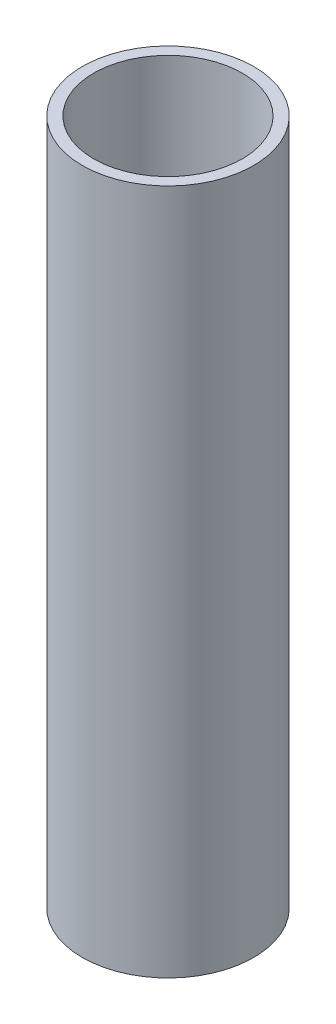
ISO-10303-21;
HEADER;
FILE_DESCRIPTION(('STEP AP214'),'2;1');
FILE_NAME('part.step','',(''),(''),'','','');
FILE_SCHEMA(('AUTOMOTIVE_DESIGN { 1 0 10303 214 1 1 1 1 }'));
ENDSEC;
DATA;
#1=APPLICATION_CONTEXT('core data for automotive mechanical design processes');
#2=APPLICATION_PROTOCOL_DEFINITION('international standard','automotive_design',2000,#1);
#3=PRODUCT_CONTEXT('',#1,'mechanical');
#4=PRODUCT('Part','Part','',(#3));
#5=PRODUCT_RELATED_PRODUCT_CATEGORY('part','',(#4));
#6=PRODUCT_DEFINITION_FORMATION('','',#4);
#7=PRODUCT_DEFINITION_CONTEXT('part definition',#1,'design');
#8=PRODUCT_DEFINITION('design','',#6,#7);
#9=PRODUCT_DEFINITION_SHAPE('','',#8);
#10=(LENGTH_UNIT() NAMED_UNIT(*) SI_UNIT(.MILLI.,.METRE.));
#11=(NAMED_UNIT(*) PLANE_ANGLE_UNIT() SI_UNIT($,.RADIAN.));
#12=(NAMED_UNIT(*) SI_UNIT($,.STERADIAN.) SOLID_ANGLE_UNIT());
#13=UNCERTAINTY_MEASURE_WITH_UNIT(LENGTH_MEASURE(1.E-05),#10,'distance_accuracy_value','');
#14=(GEOMETRIC_REPRESENTATION_CONTEXT(3) GLOBAL_UNCERTAINTY_ASSIGNED_CONTEXT((#13)) GLOBAL_UNIT_ASSIGNED_CONTEXT((#10,
#11,#12)) REPRESENTATION_CONTEXT('',''));
#15=CARTESIAN_POINT('',(0.,0.,0.));
#16=DIRECTION('',(0.,0.,1.));
#17=DIRECTION('',(1.,0.,0.));
#18=AXIS2_PLACEMENT_3D('',#15,#16,#17);
#19=CARTESIAN_POINT('',(0.,-152.4,0.));
#20=DIRECTION('',(0.,1.,0.));
#21=DIRECTION('',(0.,0.,1.));
#22=AXIS2_PLACEMENT_3D('',#19,#20,#21);
#23=CYLINDRICAL_SURFACE('',#22,19.05);
#24=CARTESIAN_POINT('',(0.,-152.4,0.));
#25=DIRECTION('',(0.,1.,0.));
#26=DIRECTION('',(0.,0.,1.));
#27=AXIS2_PLACEMENT_3D('',#24,#25,#26);
#28=CIRCLE('',#27,19.05);
#29=CARTESIAN_POINT('',(0.,-152.4,19.05));
#30=VERTEX_POINT('',#29);
#31=EDGE_CURVE('E11',#30,#30,#28,.T.);
#32=CARTESIAN_POINT('',(0.,0.,0.));
#33=DIRECTION('',(0.,1.,0.));
#34=DIRECTION('',(0.,0.,1.));
#35=AXIS2_PLACEMENT_3D('',#32,#33,#34);
#36=CIRCLE('',#35,19.05);
#37=CARTESIAN_POINT('',(0.,0.,19.05));
#38=VERTEX_POINT('',#37);
#39=EDGE_CURVE('E40',#38,#38,#36,.T.);
#40=CARTESIAN_POINT('',(0.,-152.4,19.05));
#41=CARTESIAN_POINT('',(0.,-150.8125,19.05));
#42=CARTESIAN_POINT('',(0.,-149.225,19.05));
#43=CARTESIAN_POINT('',(0.,-146.05,19.05));
#44=CARTESIAN_POINT('',(0.,-144.4625,19.05));
#45=CARTESIAN_POINT('',(0.,-141.2875,19.05));
#46=CARTESIAN_POINT('',(0.,-139.7,19.05));
#47=CARTESIAN_POINT('',(0.,-136.525,19.05));
#48=CARTESIAN_POINT('',(0.,-134.9375,19.05));
#49=CARTESIAN_POINT('',(0.,-131.7625,19.05));
#50=CARTESIAN_POINT('',(0.,-130.175,19.05));
#51=CARTESIAN_POINT('',(0.,-127.,19.05));
#52=CARTESIAN_POINT('',(0.,-125.4125,19.05));
#53=CARTESIAN_POINT('',(0.,-122.2375,19.05));
#54=CARTESIAN_POINT('',(0.,-120.65,19.05));
#55=CARTESIAN_POINT('',(0.,-117.475,19.05));
#56=CARTESIAN_POINT('',(0.,-115.8875,19.05));
#57=CARTESIAN_POINT('',(0.,-112.7125,19.05));
#58=CARTESIAN_POINT('',(0.,-111.125,19.05));
#59=CARTESIAN_POINT('',(0.,-107.95,19.05));
#60=CARTESIAN_POINT('',(0.,-106.3625,19.05));
#61=CARTESIAN_POINT('',(0.,-103.1875,19.05));
#62=CARTESIAN_POINT('',(0.,-101.6,19.05));
#63=CARTESIAN_POINT('',(0.,-98.425,19.05));
#64=CARTESIAN_POINT('',(0.,-96.8375,19.05));
#65=CARTESIAN_POINT('',(0.,-93.6625,19.05));
#66=CARTESIAN_POINT('',(0.,-92.075,19.05));
#67=CARTESIAN_POINT('',(0.,-88.9,19.05));
#68=CARTESIAN_POINT('',(0.,-87.3125,19.05));
#69=CARTESIAN_POINT('',(0.,-84.1375,19.05));
#70=CARTESIAN_POINT('',(0.,-82.55,19.05));
#71=CARTESIAN_POINT('',(0.,-79.375,19.05));
#72=CARTESIAN_POINT('',(0.,-77.7875,19.05));
#73=CARTESIAN_POINT('',(0.,-74.6125,19.05));
#74=CARTESIAN_POINT('',(0.,-73.025,19.05));
#75=CARTESIAN_POINT('',(0.,-69.85,19.05));
#76=CARTESIAN_POINT('',(0.,-68.2625,19.05));
#77=CARTESIAN_POINT('',(0.,-65.0875,19.05));
#78=CARTESIAN_POINT('',(0.,-63.5,19.05));
#79=CARTESIAN_POINT('',(0.,-60.325,19.05));
#80=CARTESIAN_POINT('',(0.,-58.7375,19.05));
#81=CARTESIAN_POINT('',(0.,-55.5625,19.05));
#82=CARTESIAN_POINT('',(0.,-53.975,19.05));
#83=CARTESIAN_POINT('',(0.,-50.8,19.05));
#84=CARTESIAN_POINT('',(0.,-49.2125,19.05));
#85=CARTESIAN_POINT('',(0.,-46.0375,19.05));
#86=CARTESIAN_POINT('',(0.,-44.45,19.05));
#87=CARTESIAN_POINT('',(0.,-41.275,19.05));
#88=CARTESIAN_POINT('',(0.,-39.6875,19.05));
#89=CARTESIAN_POINT('',(0.,-36.5125,19.05));
#90=CARTESIAN_POINT('',(0.,-34.925,19.05));
#91=CARTESIAN_POINT('',(0.,-31.75,19.05));
#92=CARTESIAN_POINT('',(0.,-30.1625,19.05));
#93=CARTESIAN_POINT('',(0.,-26.9875,19.05));
#94=CARTESIAN_POINT('',(0.,-25.4,19.05));
#95=CARTESIAN_POINT('',(0.,-22.225,19.05));
#96=CARTESIAN_POINT('',(0.,-20.6375,19.05));
#97=CARTESIAN_POINT('',(0.,-17.4625,19.05));
#98=CARTESIAN_POINT('',(0.,-15.875,19.05));
#99=CARTESIAN_POINT('',(0.,-12.7,19.05));
#100=CARTESIAN_POINT('',(0.,-11.1125,19.05));
#101=CARTESIAN_POINT('',(0.,-7.93750000000001,19.05));
#102=CARTESIAN_POINT('',(0.,-6.35,19.05));
#103=CARTESIAN_POINT('',(0.,-3.175,19.05));
#104=CARTESIAN_POINT('',(0.,-1.5875,19.05));
#105=CARTESIAN_POINT('',(0.,0.,19.05));
#106=B_SPLINE_CURVE_WITH_KNOTS('',3,(#40,#41,#42,#43,#44,#45,#46,#47,#48,#49,#50,#51,#52,#53,
#54,#55,#56,#57,#58,#59,#60,#61,#62,#63,#64,#65,#66,#67,#68,#69,#70,#71,#72,#73,#74,#75,#76,#77,
#78,#79,#80,#81,#82,#83,#84,#85,#86,#87,#88,#89,#90,#91,#92,#93,#94,#95,#96,#97,#98,#99,#100,
#101,#102,#103,#104,#105),.UNSPECIFIED.,.F.,.F.,(4,2,2,2,2,2,2,2,2,2,2,2,2,2,2,2,2,2,2,2,2,2,2,
2,2,2,2,2,2,2,2,2,4),(0.,4.76249999999998,9.52499999999998,14.2875,19.05,23.8125,28.575,33.3375,
38.1,42.8625,47.625,52.3875,57.15,61.9125,66.675,71.4375,76.2,80.9625,85.725,90.4875,95.25,
100.0125,104.775,109.5375,114.3,119.0625,123.825,128.5875,133.35,138.1125,142.875,147.6375,
152.4),.UNSPECIFIED.);
#107=EDGE_CURVE('BSEAM37',#30,#38,#106,.T.);
#108=ORIENTED_EDGE('',*,*,#31,.T.);
#109=ORIENTED_EDGE('',*,*,#39,.F.);
#110=ORIENTED_EDGE('',*,*,#107,.T.);
#111=ORIENTED_EDGE('',*,*,#107,.F.);
#112=EDGE_LOOP('',(#108,#110,#109,#111));
#113=FACE_BOUND('',#112,.T.);
#114=ADVANCED_FACE('F37',(#113),#23,.T.);
#115=CARTESIAN_POINT('',(0.,-152.4,0.));
#116=DIRECTION('',(0.,1.,0.));
#117=DIRECTION('',(0.,0.,1.));
#118=AXIS2_PLACEMENT_3D('',#115,#116,#117);
#119=PLANE('',#118);
#120=CARTESIAN_POINT('',(0.,-152.4,0.));
#121=DIRECTION('',(0.,1.,0.));
#122=DIRECTION('',(1.,0.,0.));
#123=AXIS2_PLACEMENT_3D('',#120,#121,#122);
#124=CIRCLE('',#123,16.51);
#125=CARTESIAN_POINT('',(0.,-152.4,16.51));
#126=VERTEX_POINT('',#125);
#127=EDGE_CURVE('E47',#126,#126,#124,.T.);
#128=ORIENTED_EDGE('',*,*,#127,.T.);
#129=EDGE_LOOP('',(#128));
#130=FACE_BOUND('',#129,.T.);
#131=ORIENTED_EDGE('',*,*,#31,.F.);
#132=EDGE_LOOP('',(#131));
#133=FACE_BOUND('',#132,.T.);
#134=ADVANCED_FACE('F55',(#130,#133),#119,.F.);
#135=CARTESIAN_POINT('',(0.,0.,0.));
#136=DIRECTION('',(0.,1.,0.));
#137=DIRECTION('',(0.,0.,1.));
#138=AXIS2_PLACEMENT_3D('',#135,#136,#137);
#139=PLANE('',#138);
#140=CARTESIAN_POINT('',(0.,0.,0.));
#141=DIRECTION('',(0.,1.,0.));
#142=DIRECTION('',(1.,0.,0.));
#143=AXIS2_PLACEMENT_3D('',#140,#141,#142);
#144=CIRCLE('',#143,16.51);
#145=CARTESIAN_POINT('',(0.,0.,16.51));
#146=VERTEX_POINT('',#145);
#147=EDGE_CURVE('E49',#146,#146,#144,.T.);
#148=ORIENTED_EDGE('',*,*,#147,.F.);
#149=EDGE_LOOP('',(#148));
#150=FACE_BOUND('',#149,.T.);
#151=ORIENTED_EDGE('',*,*,#39,.T.);
#152=EDGE_LOOP('',(#151));
#153=FACE_BOUND('',#152,.T.);
#154=ADVANCED_FACE('F61',(#150,#153),#139,.T.);
#155=CARTESIAN_POINT('',(0.,-152.4,0.));
#156=DIRECTION('',(0.,1.,0.));
#157=DIRECTION('',(0.,0.,1.));
#158=AXIS2_PLACEMENT_3D('',#155,#156,#157);
#159=CYLINDRICAL_SURFACE('',#158,16.51);
#160=CARTESIAN_POINT('',(0.,-152.4,16.51));
#161=CARTESIAN_POINT('',(0.,-150.8125,16.51));
#162=CARTESIAN_POINT('',(0.,-149.225,16.51));
#163=CARTESIAN_POINT('',(0.,-146.05,16.51));
#164=CARTESIAN_POINT('',(0.,-144.4625,16.51));
#165=CARTESIAN_POINT('',(0.,-141.2875,16.51));
#166=CARTESIAN_POINT('',(0.,-139.7,16.51));
#167=CARTESIAN_POINT('',(0.,-136.525,16.51));
#168=CARTESIAN_POINT('',(0.,-134.9375,16.51));
#169=CARTESIAN_POINT('',(0.,-131.7625,16.51));
#170=CARTESIAN_POINT('',(0.,-130.175,16.51));
#171=CARTESIAN_POINT('',(0.,-127.,16.51));
#172=CARTESIAN_POINT('',(0.,-125.4125,16.51));
#173=CARTESIAN_POINT('',(0.,-122.2375,16.51));
#174=CARTESIAN_POINT('',(0.,-120.65,16.51));
#175=CARTESIAN_POINT('',(0.,-117.475,16.51));
#176=CARTESIAN_POINT('',(0.,-115.8875,16.51));
#177=CARTESIAN_POINT('',(0.,-112.7125,16.51));
#178=CARTESIAN_POINT('',(0.,-111.125,16.51));
#179=CARTESIAN_POINT('',(0.,-107.95,16.51));
#180=CARTESIAN_POINT('',(0.,-106.3625,16.51));
#181=CARTESIAN_POINT('',(0.,-103.1875,16.51));
#182=CARTESIAN_POINT('',(0.,-101.6,16.51));
#183=CARTESIAN_POINT('',(0.,-98.425,16.51));
#184=CARTESIAN_POINT('',(0.,-96.8375,16.51));
#185=CARTESIAN_POINT('',(0.,-93.6625,16.51));
#186=CARTESIAN_POINT('',(0.,-92.075,16.51));
#187=CARTESIAN_POINT('',(0.,-88.9,16.51));
#188=CARTESIAN_POINT('',(0.,-87.3125,16.51));
#189=CARTESIAN_POINT('',(0.,-84.1375,16.51));
#190=CARTESIAN_POINT('',(0.,-82.55,16.51));
#191=CARTESIAN_POINT('',(0.,-79.375,16.51));
#192=CARTESIAN_POINT('',(0.,-77.7875,16.51));
#193=CARTESIAN_POINT('',(0.,-74.6125,16.51));
#194=CARTESIAN_POINT('',(0.,-73.025,16.51));
#195=CARTESIAN_POINT('',(0.,-69.85,16.51));
#196=CARTESIAN_POINT('',(0.,-68.2625,16.51));
#197=CARTESIAN_POINT('',(0.,-65.0875,16.51));
#198=CARTESIAN_POINT('',(0.,-63.5,16.51));
#199=CARTESIAN_POINT('',(0.,-60.325,16.51));
#200=CARTESIAN_POINT('',(0.,-58.7375,16.51));
#201=CARTESIAN_POINT('',(0.,-55.5625,16.51));
#202=CARTESIAN_POINT('',(0.,-53.975,16.51));
#203=CARTESIAN_POINT('',(0.,-50.8,16.51));
#204=CARTESIAN_POINT('',(0.,-49.2125,16.51));
#205=CARTESIAN_POINT('',(0.,-46.0375,16.51));
#206=CARTESIAN_POINT('',(0.,-44.45,16.51));
#207=CARTESIAN_POINT('',(0.,-41.275,16.51));
#208=CARTESIAN_POINT('',(0.,-39.6875,16.51));
#209=CARTESIAN_POINT('',(0.,-36.5125,16.51));
#210=CARTESIAN_POINT('',(0.,-34.925,16.51));
#211=CARTESIAN_POINT('',(0.,-31.75,16.51));
#212=CARTESIAN_POINT('',(0.,-30.1625,16.51));
#213=CARTESIAN_POINT('',(0.,-26.9875,16.51));
#214=CARTESIAN_POINT('',(0.,-25.4,16.51));
#215=CARTESIAN_POINT('',(0.,-22.225,16.51));
#216=CARTESIAN_POINT('',(0.,-20.6375,16.51));
#217=CARTESIAN_POINT('',(0.,-17.4625,16.51));
#218=CARTESIAN_POINT('',(0.,-15.875,16.51));
#219=CARTESIAN_POINT('',(0.,-12.7,16.51));
#220=CARTESIAN_POINT('',(0.,-11.1125,16.51));
#221=CARTESIAN_POINT('',(0.,-7.93750000000001,16.51));
#222=CARTESIAN_POINT('',(0.,-6.35,16.51));
#223=CARTESIAN_POINT('',(0.,-3.175,16.51));
#224=CARTESIAN_POINT('',(0.,-1.5875,16.51));
#225=CARTESIAN_POINT('',(0.,0.,16.51));
#226=B_SPLINE_CURVE_WITH_KNOTS('',3,(#160,#161,#162,#163,#164,#165,#166,#167,#168,#169,#170,
#171,#172,#173,#174,#175,#176,#177,#178,#179,#180,#181,#182,#183,#184,#185,#186,#187,#188,#189,
#190,#191,#192,#193,#194,#195,#196,#197,#198,#199,#200,#201,#202,#203,#204,#205,#206,#207,#208,
#209,#210,#211,#212,#213,#214,#215,#216,#217,#218,#219,#220,#221,#222,#223,#224,#225),
.UNSPECIFIED.,.F.,.F.,(4,2,2,2,2,2,2,2,2,2,2,2,2,2,2,2,2,2,2,2,2,2,2,2,2,2,2,2,2,2,2,2,4),(0.,
4.7625,9.52500000000001,14.2875,19.05,23.8125,28.575,33.3375,38.1,42.8625,47.625,52.3875,57.15,
61.9125,66.675,71.4375,76.2,80.9625,85.725,90.4875,95.25,100.0125,104.775,109.5375,114.3,
119.0625,123.825,128.5875,133.35,138.1125,142.875,147.6375,152.4),.UNSPECIFIED.);
#227=EDGE_CURVE('BSEAM58',#126,#146,#226,.T.);
#228=ORIENTED_EDGE('',*,*,#127,.F.);
#229=ORIENTED_EDGE('',*,*,#147,.T.);
#230=ORIENTED_EDGE('',*,*,#227,.T.);
#231=ORIENTED_EDGE('',*,*,#227,.F.);
#232=EDGE_LOOP('',(#228,#230,#229,#231));
#233=FACE_BOUND('',#232,.T.);
#234=ADVANCED_FACE('F58',(#233),#159,.F.);
#235=CLOSED_SHELL('',(#114,#134,#154,#234));
#236=MANIFOLD_SOLID_BREP('B2',#235);
#237=ADVANCED_BREP_SHAPE_REPRESENTATION('',(#18,#236),#14);
#238=SHAPE_DEFINITION_REPRESENTATION(#9,#237);
ENDSEC;
END-ISO-10303-21;
